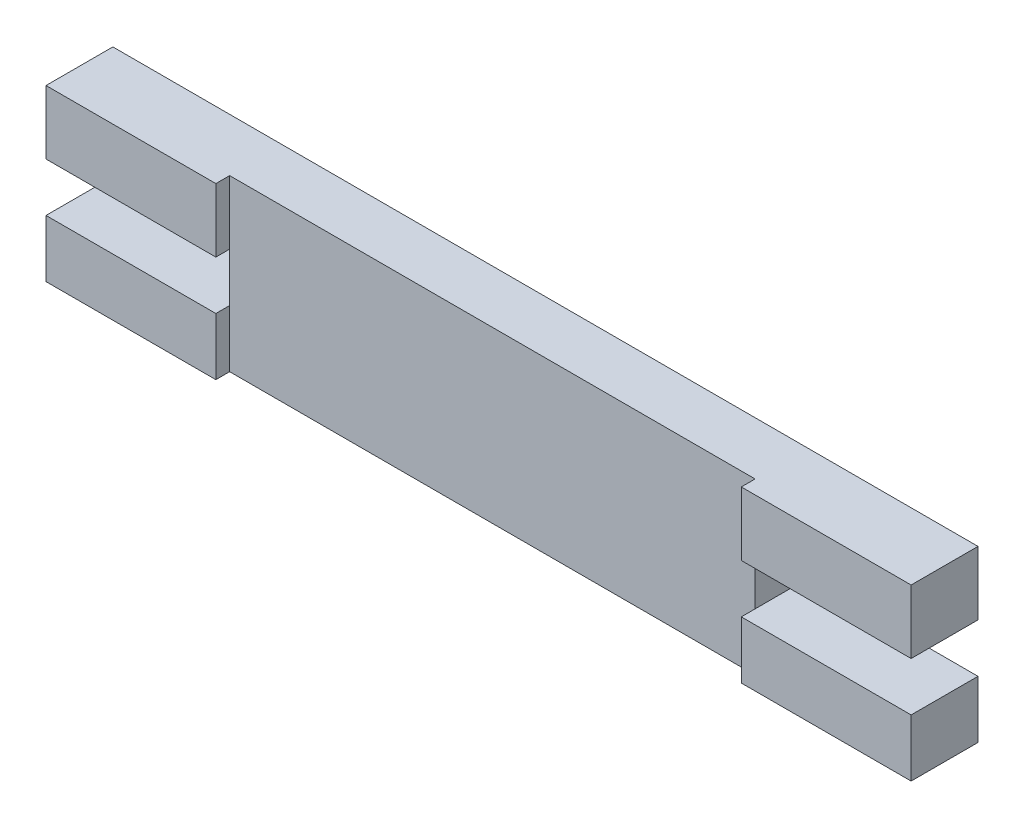
ISO-10303-21;
HEADER;
FILE_DESCRIPTION(('STEP AP214'),'2;1');
FILE_NAME('part.step','',(''),(''),'','','');
FILE_SCHEMA(('AUTOMOTIVE_DESIGN { 1 0 10303 214 1 1 1 1 }'));
ENDSEC;
DATA;
#1=APPLICATION_CONTEXT('core data for automotive mechanical design processes');
#2=APPLICATION_PROTOCOL_DEFINITION('international standard','automotive_design',2000,#1);
#3=PRODUCT_CONTEXT('',#1,'mechanical');
#4=PRODUCT('Part','Part','',(#3));
#5=PRODUCT_RELATED_PRODUCT_CATEGORY('part','',(#4));
#6=PRODUCT_DEFINITION_FORMATION('','',#4);
#7=PRODUCT_DEFINITION_CONTEXT('part definition',#1,'design');
#8=PRODUCT_DEFINITION('design','',#6,#7);
#9=PRODUCT_DEFINITION_SHAPE('','',#8);
#10=(LENGTH_UNIT() NAMED_UNIT(*) SI_UNIT(.MILLI.,.METRE.));
#11=(NAMED_UNIT(*) PLANE_ANGLE_UNIT() SI_UNIT($,.RADIAN.));
#12=(NAMED_UNIT(*) SI_UNIT($,.STERADIAN.) SOLID_ANGLE_UNIT());
#13=UNCERTAINTY_MEASURE_WITH_UNIT(LENGTH_MEASURE(1.E-05),#10,'distance_accuracy_value','');
#14=(GEOMETRIC_REPRESENTATION_CONTEXT(3) GLOBAL_UNCERTAINTY_ASSIGNED_CONTEXT((#13)) GLOBAL_UNIT_ASSIGNED_CONTEXT((#10,
#11,#12)) REPRESENTATION_CONTEXT('',''));
#15=CARTESIAN_POINT('',(0.,0.,0.));
#16=DIRECTION('',(0.,0.,1.));
#17=DIRECTION('',(1.,0.,0.));
#18=AXIS2_PLACEMENT_3D('',#15,#16,#17);
#19=CARTESIAN_POINT('',(12.375,0.,2.5));
#20=DIRECTION('',(1.,0.,0.));
#21=DIRECTION('',(0.,0.,-1.));
#22=AXIS2_PLACEMENT_3D('',#19,#20,#21);
#23=PLANE('',#22);
#24=DIRECTION('',(0.,0.,-1.));
#25=VECTOR('',#24,1.);
#26=CARTESIAN_POINT('',(12.375,0.999999999999999,3.15));
#27=LINE('',#26,#25);
#28=CARTESIAN_POINT('',(12.375,0.999999999999999,2.5));
#29=VERTEX_POINT('',#28);
#30=CARTESIAN_POINT('',(12.375,0.999999999999999,0.));
#31=VERTEX_POINT('',#30);
#32=EDGE_CURVE('E203',#29,#31,#27,.T.);
#33=ORIENTED_EDGE('',*,*,#32,.F.);
#34=DIRECTION('',(0.,-1.,0.));
#35=VECTOR('',#34,1.);
#36=CARTESIAN_POINT('',(12.375,0.,2.5));
#37=LINE('',#36,#35);
#38=CARTESIAN_POINT('',(12.375,-1.3,2.5));
#39=VERTEX_POINT('',#38);
#40=EDGE_CURVE('E326',#29,#39,#37,.T.);
#41=ORIENTED_EDGE('',*,*,#40,.T.);
#42=DIRECTION('',(0.,0.,-1.));
#43=VECTOR('',#42,1.);
#44=CARTESIAN_POINT('',(12.375,-1.3,3.15));
#45=LINE('',#44,#43);
#46=CARTESIAN_POINT('',(12.375,-1.3,0.));
#47=VERTEX_POINT('',#46);
#48=EDGE_CURVE('E11',#39,#47,#45,.T.);
#49=ORIENTED_EDGE('',*,*,#48,.T.);
#50=DIRECTION('',(0.,-1.,0.));
#51=VECTOR('',#50,1.);
#52=CARTESIAN_POINT('',(12.375,0.,0.));
#53=LINE('',#52,#51);
#54=EDGE_CURVE('E64',#31,#47,#53,.T.);
#55=ORIENTED_EDGE('',*,*,#54,.F.);
#56=EDGE_LOOP('',(#33,#41,#49,#55));
#57=FACE_BOUND('',#56,.T.);
#58=ADVANCED_FACE('F41',(#57),#23,.T.);
#59=CARTESIAN_POINT('',(-12.375,0.,2.5));
#60=DIRECTION('',(-1.,0.,0.));
#61=DIRECTION('',(0.,-1.,0.));
#62=AXIS2_PLACEMENT_3D('',#59,#60,#61);
#63=PLANE('',#62);
#64=DIRECTION('',(0.,0.,-1.));
#65=VECTOR('',#64,1.);
#66=CARTESIAN_POINT('',(-12.375,-1.3,3.15));
#67=LINE('',#66,#65);
#68=CARTESIAN_POINT('',(-12.375,-1.3,2.5));
#69=VERTEX_POINT('',#68);
#70=CARTESIAN_POINT('',(-12.375,-1.3,0.));
#71=VERTEX_POINT('',#70);
#72=EDGE_CURVE('E279',#69,#71,#67,.T.);
#73=ORIENTED_EDGE('',*,*,#72,.F.);
#74=DIRECTION('',(0.,1.,0.));
#75=VECTOR('',#74,1.);
#76=CARTESIAN_POINT('',(-12.375,0.,2.5));
#77=LINE('',#76,#75);
#78=CARTESIAN_POINT('',(-12.375,0.999999999999999,2.5));
#79=VERTEX_POINT('',#78);
#80=EDGE_CURVE('E336',#69,#79,#77,.T.);
#81=ORIENTED_EDGE('',*,*,#80,.T.);
#82=DIRECTION('',(0.,0.,-1.));
#83=VECTOR('',#82,1.);
#84=CARTESIAN_POINT('',(-12.375,0.999999999999999,3.15));
#85=LINE('',#84,#83);
#86=CARTESIAN_POINT('',(-12.375,0.999999999999999,0.));
#87=VERTEX_POINT('',#86);
#88=EDGE_CURVE('E50',#79,#87,#85,.T.);
#89=ORIENTED_EDGE('',*,*,#88,.T.);
#90=DIRECTION('',(0.,1.,0.));
#91=VECTOR('',#90,1.);
#92=CARTESIAN_POINT('',(-12.375,0.,0.));
#93=LINE('',#92,#91);
#94=EDGE_CURVE('E344',#71,#87,#93,.T.);
#95=ORIENTED_EDGE('',*,*,#94,.F.);
#96=EDGE_LOOP('',(#73,#81,#89,#95));
#97=FACE_BOUND('',#96,.T.);
#98=ADVANCED_FACE('F393',(#97),#63,.T.);
#99=CARTESIAN_POINT('',(0.,4.,2.5));
#100=DIRECTION('',(0.,1.,0.));
#101=DIRECTION('',(0.,0.,1.));
#102=AXIS2_PLACEMENT_3D('',#99,#100,#101);
#103=PLANE('',#102);
#104=DIRECTION('',(1.,0.,0.));
#105=VECTOR('',#104,1.);
#106=CARTESIAN_POINT('',(0.,4.,0.));
#107=LINE('',#106,#105);
#108=CARTESIAN_POINT('',(-20.375,4.,0.));
#109=VERTEX_POINT('',#108);
#110=CARTESIAN_POINT('',(20.375,4.,0.));
#111=VERTEX_POINT('',#110);
#112=EDGE_CURVE('E342',#109,#111,#107,.T.);
#113=ORIENTED_EDGE('',*,*,#112,.F.);
#114=DIRECTION('',(0.,0.,-1.));
#115=VECTOR('',#114,1.);
#116=CARTESIAN_POINT('',(-20.375,4.,3.15));
#117=LINE('',#116,#115);
#118=CARTESIAN_POINT('',(-20.375,4.,3.15));
#119=VERTEX_POINT('',#118);
#120=EDGE_CURVE('E300',#119,#109,#117,.T.);
#121=ORIENTED_EDGE('',*,*,#120,.F.);
#122=DIRECTION('',(1.,0.,0.));
#123=VECTOR('',#122,1.);
#124=CARTESIAN_POINT('',(0.,4.,3.15));
#125=LINE('',#124,#123);
#126=CARTESIAN_POINT('',(-12.375,4.,3.15));
#127=VERTEX_POINT('',#126);
#128=EDGE_CURVE('E296',#119,#127,#125,.T.);
#129=ORIENTED_EDGE('',*,*,#128,.T.);
#130=DIRECTION('',(0.,0.,-1.));
#131=VECTOR('',#130,1.);
#132=CARTESIAN_POINT('',(-12.375,4.,3.15));
#133=LINE('',#132,#131);
#134=CARTESIAN_POINT('',(-12.375,4.,2.5));
#135=VERTEX_POINT('',#134);
#136=EDGE_CURVE('E310',#127,#135,#133,.T.);
#137=ORIENTED_EDGE('',*,*,#136,.T.);
#138=DIRECTION('',(1.,0.,0.));
#139=VECTOR('',#138,1.);
#140=CARTESIAN_POINT('',(0.,4.,2.5));
#141=LINE('',#140,#139);
#142=CARTESIAN_POINT('',(12.375,4.,2.5));
#143=VERTEX_POINT('',#142);
#144=EDGE_CURVE('E325',#135,#143,#141,.T.);
#145=ORIENTED_EDGE('',*,*,#144,.T.);
#146=DIRECTION('',(0.,0.,-1.));
#147=VECTOR('',#146,1.);
#148=CARTESIAN_POINT('',(12.375,4.,3.15));
#149=LINE('',#148,#147);
#150=CARTESIAN_POINT('',(12.375,4.,3.15));
#151=VERTEX_POINT('',#150);
#152=EDGE_CURVE('E211',#151,#143,#149,.T.);
#153=ORIENTED_EDGE('',*,*,#152,.F.);
#154=DIRECTION('',(1.,0.,0.));
#155=VECTOR('',#154,1.);
#156=CARTESIAN_POINT('',(0.,4.,3.15));
#157=LINE('',#156,#155);
#158=CARTESIAN_POINT('',(20.375,4.,3.15));
#159=VERTEX_POINT('',#158);
#160=EDGE_CURVE('E196',#151,#159,#157,.T.);
#161=ORIENTED_EDGE('',*,*,#160,.T.);
#162=DIRECTION('',(0.,0.,-1.));
#163=VECTOR('',#162,1.);
#164=CARTESIAN_POINT('',(20.375,4.,3.15));
#165=LINE('',#164,#163);
#166=EDGE_CURVE('E180',#159,#111,#165,.T.);
#167=ORIENTED_EDGE('',*,*,#166,.T.);
#168=EDGE_LOOP('',(#113,#121,#129,#137,#145,#153,#161,#167));
#169=FACE_BOUND('',#168,.T.);
#170=ADVANCED_FACE('F397',(#169),#103,.T.);
#171=CARTESIAN_POINT('',(0.,-4.,2.5));
#172=DIRECTION('',(0.,1.,0.));
#173=DIRECTION('',(0.,0.,1.));
#174=AXIS2_PLACEMENT_3D('',#171,#172,#173);
#175=PLANE('',#174);
#176=DIRECTION('',(1.,0.,0.));
#177=VECTOR('',#176,1.);
#178=CARTESIAN_POINT('',(0.,-4.,0.));
#179=LINE('',#178,#177);
#180=CARTESIAN_POINT('',(-20.375,-4.,0.));
#181=VERTEX_POINT('',#180);
#182=CARTESIAN_POINT('',(20.375,-4.,0.));
#183=VERTEX_POINT('',#182);
#184=EDGE_CURVE('E44',#181,#183,#179,.T.);
#185=ORIENTED_EDGE('',*,*,#184,.T.);
#186=DIRECTION('',(0.,0.,-1.));
#187=VECTOR('',#186,1.);
#188=CARTESIAN_POINT('',(20.375,-4.,3.15));
#189=LINE('',#188,#187);
#190=CARTESIAN_POINT('',(20.375,-4.,3.15));
#191=VERTEX_POINT('',#190);
#192=EDGE_CURVE('E230',#191,#183,#189,.T.);
#193=ORIENTED_EDGE('',*,*,#192,.F.);
#194=DIRECTION('',(1.,0.,0.));
#195=VECTOR('',#194,1.);
#196=CARTESIAN_POINT('',(0.,-4.,3.15));
#197=LINE('',#196,#195);
#198=CARTESIAN_POINT('',(12.375,-4.,3.15));
#199=VERTEX_POINT('',#198);
#200=EDGE_CURVE('E227',#199,#191,#197,.T.);
#201=ORIENTED_EDGE('',*,*,#200,.F.);
#202=DIRECTION('',(0.,0.,-1.));
#203=VECTOR('',#202,1.);
#204=CARTESIAN_POINT('',(12.375,-4.,3.15));
#205=LINE('',#204,#203);
#206=CARTESIAN_POINT('',(12.375,-4.,2.5));
#207=VERTEX_POINT('',#206);
#208=EDGE_CURVE('E239',#199,#207,#205,.T.);
#209=ORIENTED_EDGE('',*,*,#208,.T.);
#210=DIRECTION('',(1.,0.,0.));
#211=VECTOR('',#210,1.);
#212=CARTESIAN_POINT('',(0.,-4.,2.5));
#213=LINE('',#212,#211);
#214=CARTESIAN_POINT('',(-12.375,-4.,2.5));
#215=VERTEX_POINT('',#214);
#216=EDGE_CURVE('E335',#215,#207,#213,.T.);
#217=ORIENTED_EDGE('',*,*,#216,.F.);
#218=DIRECTION('',(0.,0.,-1.));
#219=VECTOR('',#218,1.);
#220=CARTESIAN_POINT('',(-12.375,-4.,3.15));
#221=LINE('',#220,#219);
#222=CARTESIAN_POINT('',(-12.375,-4.,3.15));
#223=VERTEX_POINT('',#222);
#224=EDGE_CURVE('E264',#223,#215,#221,.T.);
#225=ORIENTED_EDGE('',*,*,#224,.F.);
#226=DIRECTION('',(1.,0.,0.));
#227=VECTOR('',#226,1.);
#228=CARTESIAN_POINT('',(0.,-4.,3.15));
#229=LINE('',#228,#227);
#230=CARTESIAN_POINT('',(-20.375,-4.,3.15));
#231=VERTEX_POINT('',#230);
#232=EDGE_CURVE('E261',#231,#223,#229,.T.);
#233=ORIENTED_EDGE('',*,*,#232,.F.);
#234=DIRECTION('',(0.,0.,-1.));
#235=VECTOR('',#234,1.);
#236=CARTESIAN_POINT('',(-20.375,-4.,3.15));
#237=LINE('',#236,#235);
#238=EDGE_CURVE('E272',#231,#181,#237,.T.);
#239=ORIENTED_EDGE('',*,*,#238,.T.);
#240=EDGE_LOOP('',(#185,#193,#201,#209,#217,#225,#233,#239));
#241=FACE_BOUND('',#240,.T.);
#242=ADVANCED_FACE('F372',(#241),#175,.F.);
#243=CARTESIAN_POINT('',(0.,0.,2.5));
#244=DIRECTION('',(0.,0.,1.));
#245=DIRECTION('',(1.,0.,0.));
#246=AXIS2_PLACEMENT_3D('',#243,#244,#245);
#247=PLANE('',#246);
#248=EDGE_CURVE('E322',#143,#29,#37,.T.);
#249=ORIENTED_EDGE('',*,*,#248,.F.);
#250=ORIENTED_EDGE('',*,*,#144,.F.);
#251=EDGE_CURVE('E331',#79,#135,#77,.T.);
#252=ORIENTED_EDGE('',*,*,#251,.F.);
#253=ORIENTED_EDGE('',*,*,#80,.F.);
#254=EDGE_CURVE('E332',#215,#69,#77,.T.);
#255=ORIENTED_EDGE('',*,*,#254,.F.);
#256=ORIENTED_EDGE('',*,*,#216,.T.);
#257=EDGE_CURVE('E327',#39,#207,#37,.T.);
#258=ORIENTED_EDGE('',*,*,#257,.F.);
#259=ORIENTED_EDGE('',*,*,#40,.F.);
#260=EDGE_LOOP('',(#249,#250,#252,#253,#255,#256,#258,#259));
#261=FACE_BOUND('',#260,.T.);
#262=ADVANCED_FACE('F367',(#261),#247,.T.);
#263=CARTESIAN_POINT('',(0.,0.,0.));
#264=DIRECTION('',(0.,0.,1.));
#265=DIRECTION('',(1.,0.,0.));
#266=AXIS2_PLACEMENT_3D('',#263,#264,#265);
#267=PLANE('',#266);
#268=ORIENTED_EDGE('',*,*,#112,.T.);
#269=DIRECTION('',(0.,-1.,0.));
#270=VECTOR('',#269,1.);
#271=CARTESIAN_POINT('',(20.375,0.,0.));
#272=LINE('',#271,#270);
#273=CARTESIAN_POINT('',(20.375,0.999999999999999,0.));
#274=VERTEX_POINT('',#273);
#275=EDGE_CURVE('E191',#111,#274,#272,.T.);
#276=ORIENTED_EDGE('',*,*,#275,.T.);
#277=DIRECTION('',(-1.,0.,0.));
#278=VECTOR('',#277,1.);
#279=CARTESIAN_POINT('',(0.,0.999999999999999,0.));
#280=LINE('',#279,#278);
#281=EDGE_CURVE('E59',#274,#31,#280,.T.);
#282=ORIENTED_EDGE('',*,*,#281,.T.);
#283=ORIENTED_EDGE('',*,*,#54,.T.);
#284=DIRECTION('',(-1.,0.,0.));
#285=VECTOR('',#284,1.);
#286=CARTESIAN_POINT('',(0.,-1.3,0.));
#287=LINE('',#286,#285);
#288=CARTESIAN_POINT('',(20.375,-1.3,0.));
#289=VERTEX_POINT('',#288);
#290=EDGE_CURVE('E221',#289,#47,#287,.T.);
#291=ORIENTED_EDGE('',*,*,#290,.F.);
#292=DIRECTION('',(0.,-1.,0.));
#293=VECTOR('',#292,1.);
#294=CARTESIAN_POINT('',(20.375,0.,0.));
#295=LINE('',#294,#293);
#296=EDGE_CURVE('E179',#289,#183,#295,.T.);
#297=ORIENTED_EDGE('',*,*,#296,.T.);
#298=ORIENTED_EDGE('',*,*,#184,.F.);
#299=DIRECTION('',(0.,-1.,0.));
#300=VECTOR('',#299,1.);
#301=CARTESIAN_POINT('',(-20.375,0.,0.));
#302=LINE('',#301,#300);
#303=CARTESIAN_POINT('',(-20.375,-1.3,0.));
#304=VERTEX_POINT('',#303);
#305=EDGE_CURVE('E254',#304,#181,#302,.T.);
#306=ORIENTED_EDGE('',*,*,#305,.F.);
#307=DIRECTION('',(1.,0.,0.));
#308=VECTOR('',#307,1.);
#309=CARTESIAN_POINT('',(0.,-1.3,0.));
#310=LINE('',#309,#308);
#311=EDGE_CURVE('E248',#304,#71,#310,.T.);
#312=ORIENTED_EDGE('',*,*,#311,.T.);
#313=ORIENTED_EDGE('',*,*,#94,.T.);
#314=DIRECTION('',(1.,0.,0.));
#315=VECTOR('',#314,1.);
#316=CARTESIAN_POINT('',(0.,0.999999999999999,0.));
#317=LINE('',#316,#315);
#318=CARTESIAN_POINT('',(-20.375,0.999999999999999,0.));
#319=VERTEX_POINT('',#318);
#320=EDGE_CURVE('E290',#319,#87,#317,.T.);
#321=ORIENTED_EDGE('',*,*,#320,.F.);
#322=DIRECTION('',(0.,-1.,0.));
#323=VECTOR('',#322,1.);
#324=CARTESIAN_POINT('',(-20.375,0.,0.));
#325=LINE('',#324,#323);
#326=EDGE_CURVE('E284',#109,#319,#325,.T.);
#327=ORIENTED_EDGE('',*,*,#326,.F.);
#328=EDGE_LOOP('',(#268,#276,#282,#283,#291,#297,#298,#306,#312,#313,#321,#327));
#329=FACE_BOUND('',#328,.T.);
#330=ADVANCED_FACE('F380',(#329),#267,.F.);
#331=CARTESIAN_POINT('',(-12.375,0.,3.15));
#332=DIRECTION('',(-1.,0.,0.));
#333=DIRECTION('',(0.,-1.,0.));
#334=AXIS2_PLACEMENT_3D('',#331,#332,#333);
#335=PLANE('',#334);
#336=CARTESIAN_POINT('',(-12.375,0.999999999999999,3.15));
#337=VERTEX_POINT('',#336);
#338=EDGE_CURVE('E314',#337,#79,#85,.T.);
#339=ORIENTED_EDGE('',*,*,#338,.T.);
#340=ORIENTED_EDGE('',*,*,#251,.T.);
#341=ORIENTED_EDGE('',*,*,#136,.F.);
#342=DIRECTION('',(0.,1.,0.));
#343=VECTOR('',#342,1.);
#344=CARTESIAN_POINT('',(-12.375,0.,3.15));
#345=LINE('',#344,#343);
#346=EDGE_CURVE('E293',#337,#127,#345,.T.);
#347=ORIENTED_EDGE('',*,*,#346,.F.);
#348=EDGE_LOOP('',(#339,#340,#341,#347));
#349=FACE_BOUND('',#348,.T.);
#350=ADVANCED_FACE('F410',(#349),#335,.F.);
#351=CARTESIAN_POINT('',(-20.375,0.,3.15));
#352=DIRECTION('',(1.,0.,0.));
#353=DIRECTION('',(0.,1.,0.));
#354=AXIS2_PLACEMENT_3D('',#351,#352,#353);
#355=PLANE('',#354);
#356=ORIENTED_EDGE('',*,*,#326,.T.);
#357=DIRECTION('',(0.,0.,-1.));
#358=VECTOR('',#357,1.);
#359=CARTESIAN_POINT('',(-20.375,0.999999999999999,3.15));
#360=LINE('',#359,#358);
#361=CARTESIAN_POINT('',(-20.375,0.999999999999999,3.15));
#362=VERTEX_POINT('',#361);
#363=EDGE_CURVE('E318',#362,#319,#360,.T.);
#364=ORIENTED_EDGE('',*,*,#363,.F.);
#365=DIRECTION('',(0.,-1.,0.));
#366=VECTOR('',#365,1.);
#367=CARTESIAN_POINT('',(-20.375,0.,3.15));
#368=LINE('',#367,#366);
#369=EDGE_CURVE('E285',#119,#362,#368,.T.);
#370=ORIENTED_EDGE('',*,*,#369,.F.);
#371=ORIENTED_EDGE('',*,*,#120,.T.);
#372=EDGE_LOOP('',(#356,#364,#370,#371));
#373=FACE_BOUND('',#372,.T.);
#374=ADVANCED_FACE('F413',(#373),#355,.F.);
#375=CARTESIAN_POINT('',(0.,0.999999999999999,3.15));
#376=DIRECTION('',(0.,1.,0.));
#377=DIRECTION('',(0.,0.,1.));
#378=AXIS2_PLACEMENT_3D('',#375,#376,#377);
#379=PLANE('',#378);
#380=ORIENTED_EDGE('',*,*,#320,.T.);
#381=ORIENTED_EDGE('',*,*,#88,.F.);
#382=ORIENTED_EDGE('',*,*,#338,.F.);
#383=DIRECTION('',(1.,0.,0.));
#384=VECTOR('',#383,1.);
#385=CARTESIAN_POINT('',(0.,0.999999999999999,3.15));
#386=LINE('',#385,#384);
#387=EDGE_CURVE('E289',#362,#337,#386,.T.);
#388=ORIENTED_EDGE('',*,*,#387,.F.);
#389=ORIENTED_EDGE('',*,*,#363,.T.);
#390=EDGE_LOOP('',(#380,#381,#382,#388,#389));
#391=FACE_BOUND('',#390,.T.);
#392=ADVANCED_FACE('F416',(#391),#379,.F.);
#393=CARTESIAN_POINT('',(0.,0.,3.15));
#394=DIRECTION('',(0.,0.,1.));
#395=DIRECTION('',(1.,0.,0.));
#396=AXIS2_PLACEMENT_3D('',#393,#394,#395);
#397=PLANE('',#396);
#398=ORIENTED_EDGE('',*,*,#369,.T.);
#399=ORIENTED_EDGE('',*,*,#387,.T.);
#400=ORIENTED_EDGE('',*,*,#346,.T.);
#401=ORIENTED_EDGE('',*,*,#128,.F.);
#402=EDGE_LOOP('',(#398,#399,#400,#401));
#403=FACE_BOUND('',#402,.T.);
#404=ADVANCED_FACE('F420',(#403),#397,.T.);
#405=CARTESIAN_POINT('',(-12.375,0.,3.15));
#406=DIRECTION('',(1.,0.,0.));
#407=DIRECTION('',(0.,1.,0.));
#408=AXIS2_PLACEMENT_3D('',#405,#406,#407);
#409=PLANE('',#408);
#410=ORIENTED_EDGE('',*,*,#224,.T.);
#411=ORIENTED_EDGE('',*,*,#254,.T.);
#412=CARTESIAN_POINT('',(-12.375,-1.3,3.15));
#413=VERTEX_POINT('',#412);
#414=EDGE_CURVE('E280',#413,#69,#67,.T.);
#415=ORIENTED_EDGE('',*,*,#414,.F.);
#416=DIRECTION('',(0.,-1.,0.));
#417=VECTOR('',#416,1.);
#418=CARTESIAN_POINT('',(-12.375,0.,3.15));
#419=LINE('',#418,#417);
#420=EDGE_CURVE('E249',#413,#223,#419,.T.);
#421=ORIENTED_EDGE('',*,*,#420,.T.);
#422=EDGE_LOOP('',(#410,#411,#415,#421));
#423=FACE_BOUND('',#422,.T.);
#424=ADVANCED_FACE('F427',(#423),#409,.T.);
#425=CARTESIAN_POINT('',(0.,-1.3,3.15));
#426=DIRECTION('',(0.,1.,0.));
#427=DIRECTION('',(0.,0.,1.));
#428=AXIS2_PLACEMENT_3D('',#425,#426,#427);
#429=PLANE('',#428);
#430=ORIENTED_EDGE('',*,*,#311,.F.);
#431=DIRECTION('',(0.,0.,-1.));
#432=VECTOR('',#431,1.);
#433=CARTESIAN_POINT('',(-20.375,-1.3,3.15));
#434=LINE('',#433,#432);
#435=CARTESIAN_POINT('',(-20.375,-1.3,3.15));
#436=VERTEX_POINT('',#435);
#437=EDGE_CURVE('E276',#436,#304,#434,.T.);
#438=ORIENTED_EDGE('',*,*,#437,.F.);
#439=DIRECTION('',(1.,0.,0.));
#440=VECTOR('',#439,1.);
#441=CARTESIAN_POINT('',(0.,-1.3,3.15));
#442=LINE('',#441,#440);
#443=EDGE_CURVE('E253',#436,#413,#442,.T.);
#444=ORIENTED_EDGE('',*,*,#443,.T.);
#445=ORIENTED_EDGE('',*,*,#414,.T.);
#446=ORIENTED_EDGE('',*,*,#72,.T.);
#447=EDGE_LOOP('',(#430,#438,#444,#445,#446));
#448=FACE_BOUND('',#447,.T.);
#449=ADVANCED_FACE('F431',(#448),#429,.T.);
#450=CARTESIAN_POINT('',(-20.375,0.,3.15));
#451=DIRECTION('',(1.,0.,0.));
#452=DIRECTION('',(0.,1.,0.));
#453=AXIS2_PLACEMENT_3D('',#450,#451,#452);
#454=PLANE('',#453);
#455=ORIENTED_EDGE('',*,*,#305,.T.);
#456=ORIENTED_EDGE('',*,*,#238,.F.);
#457=DIRECTION('',(0.,-1.,0.));
#458=VECTOR('',#457,1.);
#459=CARTESIAN_POINT('',(-20.375,0.,3.15));
#460=LINE('',#459,#458);
#461=EDGE_CURVE('E258',#436,#231,#460,.T.);
#462=ORIENTED_EDGE('',*,*,#461,.F.);
#463=ORIENTED_EDGE('',*,*,#437,.T.);
#464=EDGE_LOOP('',(#455,#456,#462,#463));
#465=FACE_BOUND('',#464,.T.);
#466=ADVANCED_FACE('F435',(#465),#454,.F.);
#467=CARTESIAN_POINT('',(0.,0.,3.15));
#468=DIRECTION('',(0.,0.,1.));
#469=DIRECTION('',(1.,0.,0.));
#470=AXIS2_PLACEMENT_3D('',#467,#468,#469);
#471=PLANE('',#470);
#472=ORIENTED_EDGE('',*,*,#420,.F.);
#473=ORIENTED_EDGE('',*,*,#443,.F.);
#474=ORIENTED_EDGE('',*,*,#461,.T.);
#475=ORIENTED_EDGE('',*,*,#232,.T.);
#476=EDGE_LOOP('',(#472,#473,#474,#475));
#477=FACE_BOUND('',#476,.T.);
#478=ADVANCED_FACE('F389',(#477),#471,.T.);
#479=CARTESIAN_POINT('',(12.375,0.,3.15));
#480=DIRECTION('',(1.,0.,0.));
#481=DIRECTION('',(0.,1.,0.));
#482=AXIS2_PLACEMENT_3D('',#479,#480,#481);
#483=PLANE('',#482);
#484=CARTESIAN_POINT('',(12.375,-1.3,3.15));
#485=VERTEX_POINT('',#484);
#486=EDGE_CURVE('E52',#485,#39,#45,.T.);
#487=ORIENTED_EDGE('',*,*,#486,.T.);
#488=ORIENTED_EDGE('',*,*,#257,.T.);
#489=ORIENTED_EDGE('',*,*,#208,.F.);
#490=DIRECTION('',(0.,-1.,0.));
#491=VECTOR('',#490,1.);
#492=CARTESIAN_POINT('',(12.375,0.,3.15));
#493=LINE('',#492,#491);
#494=EDGE_CURVE('E224',#485,#199,#493,.T.);
#495=ORIENTED_EDGE('',*,*,#494,.F.);
#496=EDGE_LOOP('',(#487,#488,#489,#495));
#497=FACE_BOUND('',#496,.T.);
#498=ADVANCED_FACE('F366',(#497),#483,.F.);
#499=CARTESIAN_POINT('',(20.375,0.,3.15));
#500=DIRECTION('',(1.,0.,0.));
#501=DIRECTION('',(0.,0.,-1.));
#502=AXIS2_PLACEMENT_3D('',#499,#500,#501);
#503=PLANE('',#502);
#504=ORIENTED_EDGE('',*,*,#296,.F.);
#505=DIRECTION('',(0.,0.,-1.));
#506=VECTOR('',#505,1.);
#507=CARTESIAN_POINT('',(20.375,-1.3,3.15));
#508=LINE('',#507,#506);
#509=CARTESIAN_POINT('',(20.375,-1.3,3.15));
#510=VERTEX_POINT('',#509);
#511=EDGE_CURVE('E245',#510,#289,#508,.T.);
#512=ORIENTED_EDGE('',*,*,#511,.F.);
#513=DIRECTION('',(0.,-1.,0.));
#514=VECTOR('',#513,1.);
#515=CARTESIAN_POINT('',(20.375,0.,3.15));
#516=LINE('',#515,#514);
#517=EDGE_CURVE('E216',#510,#191,#516,.T.);
#518=ORIENTED_EDGE('',*,*,#517,.T.);
#519=ORIENTED_EDGE('',*,*,#192,.T.);
#520=EDGE_LOOP('',(#504,#512,#518,#519));
#521=FACE_BOUND('',#520,.T.);
#522=ADVANCED_FACE('F381',(#521),#503,.T.);
#523=CARTESIAN_POINT('',(0.,-1.3,3.15));
#524=DIRECTION('',(0.,-1.,0.));
#525=DIRECTION('',(0.,0.,-1.));
#526=AXIS2_PLACEMENT_3D('',#523,#524,#525);
#527=PLANE('',#526);
#528=ORIENTED_EDGE('',*,*,#290,.T.);
#529=ORIENTED_EDGE('',*,*,#48,.F.);
#530=ORIENTED_EDGE('',*,*,#486,.F.);
#531=DIRECTION('',(-1.,0.,0.));
#532=VECTOR('',#531,1.);
#533=CARTESIAN_POINT('',(0.,-1.3,3.15));
#534=LINE('',#533,#532);
#535=EDGE_CURVE('E220',#510,#485,#534,.T.);
#536=ORIENTED_EDGE('',*,*,#535,.F.);
#537=ORIENTED_EDGE('',*,*,#511,.T.);
#538=EDGE_LOOP('',(#528,#529,#530,#536,#537));
#539=FACE_BOUND('',#538,.T.);
#540=ADVANCED_FACE('F363',(#539),#527,.F.);
#541=CARTESIAN_POINT('',(0.,0.,3.15));
#542=DIRECTION('',(0.,0.,1.));
#543=DIRECTION('',(1.,0.,0.));
#544=AXIS2_PLACEMENT_3D('',#541,#542,#543);
#545=PLANE('',#544);
#546=ORIENTED_EDGE('',*,*,#517,.F.);
#547=ORIENTED_EDGE('',*,*,#535,.T.);
#548=ORIENTED_EDGE('',*,*,#494,.T.);
#549=ORIENTED_EDGE('',*,*,#200,.T.);
#550=EDGE_LOOP('',(#546,#547,#548,#549));
#551=FACE_BOUND('',#550,.T.);
#552=ADVANCED_FACE('F377',(#551),#545,.T.);
#553=CARTESIAN_POINT('',(0.,0.999999999999999,3.15));
#554=DIRECTION('',(0.,-1.,0.));
#555=DIRECTION('',(0.,0.,-1.));
#556=AXIS2_PLACEMENT_3D('',#553,#554,#555);
#557=PLANE('',#556);
#558=ORIENTED_EDGE('',*,*,#281,.F.);
#559=DIRECTION('',(0.,0.,-1.));
#560=VECTOR('',#559,1.);
#561=CARTESIAN_POINT('',(20.375,0.999999999999999,3.15));
#562=LINE('',#561,#560);
#563=CARTESIAN_POINT('',(20.375,0.999999999999999,3.15));
#564=VERTEX_POINT('',#563);
#565=EDGE_CURVE('E169',#564,#274,#562,.T.);
#566=ORIENTED_EDGE('',*,*,#565,.F.);
#567=DIRECTION('',(-1.,0.,0.));
#568=VECTOR('',#567,1.);
#569=CARTESIAN_POINT('',(0.,0.999999999999999,3.15));
#570=LINE('',#569,#568);
#571=CARTESIAN_POINT('',(12.375,0.999999999999999,3.15));
#572=VERTEX_POINT('',#571);
#573=EDGE_CURVE('E173',#564,#572,#570,.T.);
#574=ORIENTED_EDGE('',*,*,#573,.T.);
#575=EDGE_CURVE('E208',#572,#29,#27,.T.);
#576=ORIENTED_EDGE('',*,*,#575,.T.);
#577=ORIENTED_EDGE('',*,*,#32,.T.);
#578=EDGE_LOOP('',(#558,#566,#574,#576,#577));
#579=FACE_BOUND('',#578,.T.);
#580=ADVANCED_FACE('F171',(#579),#557,.T.);
#581=CARTESIAN_POINT('',(20.375,0.,3.15));
#582=DIRECTION('',(1.,0.,0.));
#583=DIRECTION('',(0.,0.,-1.));
#584=AXIS2_PLACEMENT_3D('',#581,#582,#583);
#585=PLANE('',#584);
#586=ORIENTED_EDGE('',*,*,#275,.F.);
#587=ORIENTED_EDGE('',*,*,#166,.F.);
#588=DIRECTION('',(0.,-1.,0.));
#589=VECTOR('',#588,1.);
#590=CARTESIAN_POINT('',(20.375,0.,3.15));
#591=LINE('',#590,#589);
#592=EDGE_CURVE('E186',#159,#564,#591,.T.);
#593=ORIENTED_EDGE('',*,*,#592,.T.);
#594=ORIENTED_EDGE('',*,*,#565,.T.);
#595=EDGE_LOOP('',(#586,#587,#593,#594));
#596=FACE_BOUND('',#595,.T.);
#597=ADVANCED_FACE('F193',(#596),#585,.T.);
#598=CARTESIAN_POINT('',(12.375,0.,3.15));
#599=DIRECTION('',(-1.,0.,0.));
#600=DIRECTION('',(0.,-1.,0.));
#601=AXIS2_PLACEMENT_3D('',#598,#599,#600);
#602=PLANE('',#601);
#603=ORIENTED_EDGE('',*,*,#152,.T.);
#604=ORIENTED_EDGE('',*,*,#248,.T.);
#605=ORIENTED_EDGE('',*,*,#575,.F.);
#606=DIRECTION('',(0.,1.,0.));
#607=VECTOR('',#606,1.);
#608=CARTESIAN_POINT('',(12.375,0.,3.15));
#609=LINE('',#608,#607);
#610=EDGE_CURVE('E189',#572,#151,#609,.T.);
#611=ORIENTED_EDGE('',*,*,#610,.T.);
#612=EDGE_LOOP('',(#603,#604,#605,#611));
#613=FACE_BOUND('',#612,.T.);
#614=ADVANCED_FACE('F463',(#613),#602,.T.);
#615=CARTESIAN_POINT('',(0.,0.,3.15));
#616=DIRECTION('',(0.,0.,1.));
#617=DIRECTION('',(1.,0.,0.));
#618=AXIS2_PLACEMENT_3D('',#615,#616,#617);
#619=PLANE('',#618);
#620=ORIENTED_EDGE('',*,*,#573,.F.);
#621=ORIENTED_EDGE('',*,*,#592,.F.);
#622=ORIENTED_EDGE('',*,*,#160,.F.);
#623=ORIENTED_EDGE('',*,*,#610,.F.);
#624=EDGE_LOOP('',(#620,#621,#622,#623));
#625=FACE_BOUND('',#624,.T.);
#626=ADVANCED_FACE('F184',(#625),#619,.T.);
#627=CLOSED_SHELL('',(#58,#98,#170,#242,#262,#330,#350,#374,#392,#404,#424,#449,#466,#478,#498,
#522,#540,#552,#580,#597,#614,#626));
#628=MANIFOLD_SOLID_BREP('B2',#627);
#629=ADVANCED_BREP_SHAPE_REPRESENTATION('',(#18,#628),#14);
#630=SHAPE_DEFINITION_REPRESENTATION(#9,#629);
ENDSEC;
END-ISO-10303-21;
